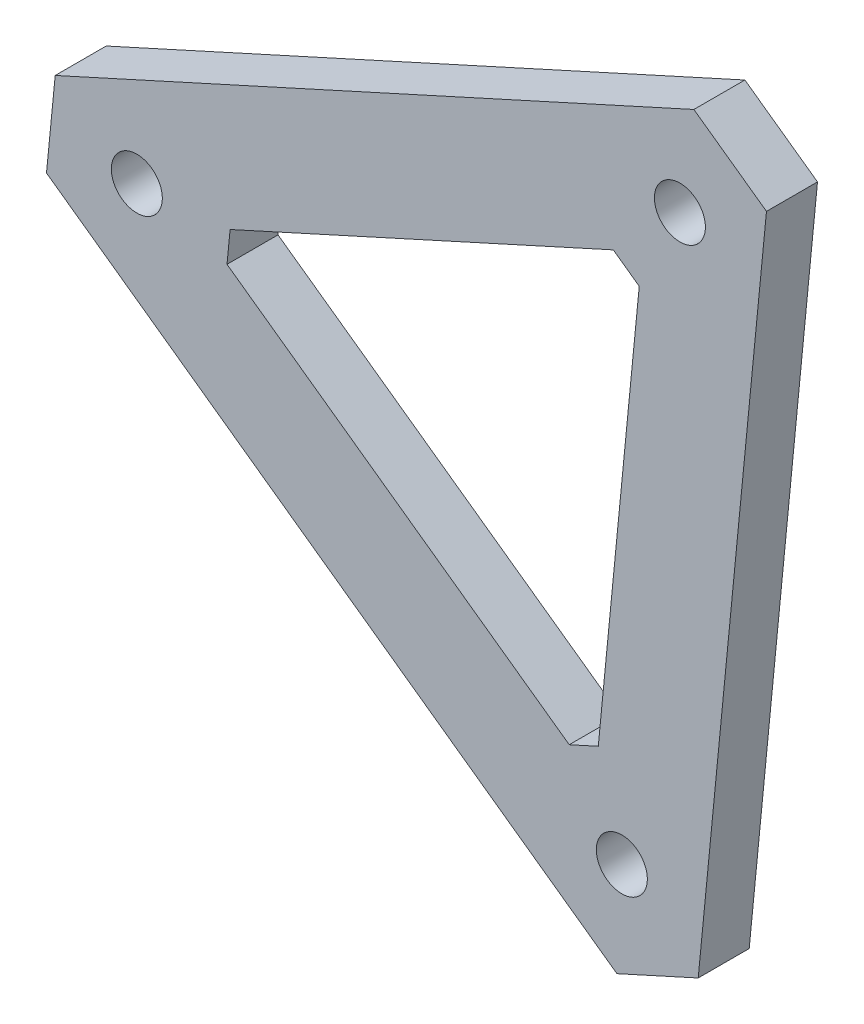
ISO-10303-21;
HEADER;
FILE_DESCRIPTION(('STEP AP214'),'2;1');
FILE_NAME('part.step','',(''),(''),'','','');
FILE_SCHEMA(('AUTOMOTIVE_DESIGN { 1 0 10303 214 1 1 1 1 }'));
ENDSEC;
DATA;
#1=APPLICATION_CONTEXT('core data for automotive mechanical design processes');
#2=APPLICATION_PROTOCOL_DEFINITION('international standard','automotive_design',2000,#1);
#3=PRODUCT_CONTEXT('',#1,'mechanical');
#4=PRODUCT('Part','Part','',(#3));
#5=PRODUCT_RELATED_PRODUCT_CATEGORY('part','',(#4));
#6=PRODUCT_DEFINITION_FORMATION('','',#4);
#7=PRODUCT_DEFINITION_CONTEXT('part definition',#1,'design');
#8=PRODUCT_DEFINITION('design','',#6,#7);
#9=PRODUCT_DEFINITION_SHAPE('','',#8);
#10=(LENGTH_UNIT() NAMED_UNIT(*) SI_UNIT(.MILLI.,.METRE.));
#11=(NAMED_UNIT(*) PLANE_ANGLE_UNIT() SI_UNIT($,.RADIAN.));
#12=(NAMED_UNIT(*) SI_UNIT($,.STERADIAN.) SOLID_ANGLE_UNIT());
#13=UNCERTAINTY_MEASURE_WITH_UNIT(LENGTH_MEASURE(1.E-05),#10,'distance_accuracy_value','');
#14=(GEOMETRIC_REPRESENTATION_CONTEXT(3) GLOBAL_UNCERTAINTY_ASSIGNED_CONTEXT((#13)) GLOBAL_UNIT_ASSIGNED_CONTEXT((#10,
#11,#12)) REPRESENTATION_CONTEXT('',''));
#15=CARTESIAN_POINT('',(0.,0.,0.));
#16=DIRECTION('',(0.,0.,1.));
#17=DIRECTION('',(1.,0.,0.));
#18=AXIS2_PLACEMENT_3D('',#15,#16,#17);
#19=CARTESIAN_POINT('',(277.371059914553,170.655756993951,-25.4));
#20=DIRECTION('',(0.581941296119595,0.813230796189277,0.));
#21=DIRECTION('',(-0.813230796189277,0.581941296119595,0.));
#22=AXIS2_PLACEMENT_3D('',#19,#20,#21);
#23=PLANE('',#22);
#24=DIRECTION('',(-0.813230796189277,0.581941296119595,0.));
#25=VECTOR('',#24,1.);
#26=CARTESIAN_POINT('',(277.371059914553,170.655756993951,0.));
#27=LINE('',#26,#25);
#28=CARTESIAN_POINT('',(313.519168805166,144.788466381435,0.));
#29=VERTEX_POINT('',#28);
#30=CARTESIAN_POINT('',(277.371059914553,170.655756993951,0.));
#31=VERTEX_POINT('',#30);
#32=EDGE_CURVE('E192',#29,#31,#27,.T.);
#33=ORIENTED_EDGE('',*,*,#32,.F.);
#34=DIRECTION('',(0.,0.,1.));
#35=VECTOR('',#34,1.);
#36=CARTESIAN_POINT('',(313.519168805166,144.788466381435,-25.4));
#37=LINE('',#36,#35);
#38=CARTESIAN_POINT('',(313.519168805166,144.788466381435,-25.4));
#39=VERTEX_POINT('',#38);
#40=EDGE_CURVE('E11',#39,#29,#37,.T.);
#41=ORIENTED_EDGE('',*,*,#40,.F.);
#42=DIRECTION('',(-0.813230796189277,0.581941296119595,0.));
#43=VECTOR('',#42,1.);
#44=CARTESIAN_POINT('',(277.371059914553,170.655756993951,-25.4));
#45=LINE('',#44,#43);
#46=CARTESIAN_POINT('',(277.371059914553,170.655756993951,-25.4));
#47=VERTEX_POINT('',#46);
#48=EDGE_CURVE('E195',#39,#47,#45,.T.);
#49=ORIENTED_EDGE('',*,*,#48,.T.);
#50=DIRECTION('',(0.,0.,1.));
#51=VECTOR('',#50,1.);
#52=CARTESIAN_POINT('',(277.371059914553,170.655756993951,-25.4));
#53=LINE('',#52,#51);
#54=EDGE_CURVE('E40',#47,#31,#53,.T.);
#55=ORIENTED_EDGE('',*,*,#54,.T.);
#56=EDGE_LOOP('',(#33,#41,#49,#55));
#57=FACE_BOUND('',#56,.T.);
#58=ADVANCED_FACE('F37',(#57),#23,.T.);
#59=CARTESIAN_POINT('',(279.515997466396,-202.802308580885,-25.4));
#60=DIRECTION('',(0.995249176699556,-0.0973605478561793,0.));
#61=DIRECTION('',(0.0973605478561793,0.995249176699556,0.));
#62=AXIS2_PLACEMENT_3D('',#59,#60,#61);
#63=PLANE('',#62);
#64=DIRECTION('',(0.0973605478561793,0.995249176699556,0.));
#65=VECTOR('',#64,1.);
#66=CARTESIAN_POINT('',(279.515997466396,-202.802308580885,0.));
#67=LINE('',#66,#65);
#68=CARTESIAN_POINT('',(279.515997466396,-202.802308580885,0.));
#69=VERTEX_POINT('',#68);
#70=EDGE_CURVE('E199',#69,#29,#67,.T.);
#71=ORIENTED_EDGE('',*,*,#70,.F.);
#72=DIRECTION('',(0.,0.,1.));
#73=VECTOR('',#72,1.);
#74=CARTESIAN_POINT('',(279.515997466396,-202.802308580885,-25.4));
#75=LINE('',#74,#73);
#76=CARTESIAN_POINT('',(279.515997466396,-202.802308580885,-25.4));
#77=VERTEX_POINT('',#76);
#78=EDGE_CURVE('E45',#77,#69,#75,.T.);
#79=ORIENTED_EDGE('',*,*,#78,.F.);
#80=DIRECTION('',(0.0973605478561793,0.995249176699556,0.));
#81=VECTOR('',#80,1.);
#82=CARTESIAN_POINT('',(279.515997466396,-202.802308580885,-25.4));
#83=LINE('',#82,#81);
#84=EDGE_CURVE('E211',#77,#39,#83,.T.);
#85=ORIENTED_EDGE('',*,*,#84,.T.);
#86=ORIENTED_EDGE('',*,*,#40,.T.);
#87=EDGE_LOOP('',(#71,#79,#85,#86));
#88=FACE_BOUND('',#87,.T.);
#89=ADVANCED_FACE('F248',(#88),#63,.T.);
#90=CARTESIAN_POINT('',(239.040212223575,-221.173843872663,-25.4));
#91=DIRECTION('',(0.413307880579936,-0.910591344045462,0.));
#92=DIRECTION('',(0.910591344045462,0.413307880579936,0.));
#93=AXIS2_PLACEMENT_3D('',#90,#91,#92);
#94=PLANE('',#93);
#95=DIRECTION('',(0.910591344045462,0.413307880579936,0.));
#96=VECTOR('',#95,1.);
#97=CARTESIAN_POINT('',(239.040212223575,-221.173843872663,0.));
#98=LINE('',#97,#96);
#99=CARTESIAN_POINT('',(239.040212223575,-221.173843872663,0.));
#100=VERTEX_POINT('',#99);
#101=EDGE_CURVE('E225',#100,#69,#98,.T.);
#102=ORIENTED_EDGE('',*,*,#101,.F.);
#103=DIRECTION('',(0.,0.,1.));
#104=VECTOR('',#103,1.);
#105=CARTESIAN_POINT('',(239.040212223575,-221.173843872663,-25.4));
#106=LINE('',#105,#104);
#107=CARTESIAN_POINT('',(239.040212223575,-221.173843872663,-25.4));
#108=VERTEX_POINT('',#107);
#109=EDGE_CURVE('E231',#108,#100,#106,.T.);
#110=ORIENTED_EDGE('',*,*,#109,.F.);
#111=DIRECTION('',(0.910591344045462,0.413307880579936,0.));
#112=VECTOR('',#111,1.);
#113=CARTESIAN_POINT('',(239.040212223575,-221.173843872663,-25.4));
#114=LINE('',#113,#112);
#115=EDGE_CURVE('E208',#108,#77,#114,.T.);
#116=ORIENTED_EDGE('',*,*,#115,.T.);
#117=ORIENTED_EDGE('',*,*,#78,.T.);
#118=EDGE_LOOP('',(#102,#110,#116,#117));
#119=FACE_BOUND('',#118,.T.);
#120=ADVANCED_FACE('F260',(#119),#94,.T.);
#121=CARTESIAN_POINT('',(-44.9806433455296,-17.9308462028934,-25.4));
#122=DIRECTION('',(-0.581941296119598,-0.813230796189275,0.));
#123=DIRECTION('',(0.813230796189276,-0.581941296119598,0.));
#124=AXIS2_PLACEMENT_3D('',#121,#122,#123);
#125=PLANE('',#124);
#126=DIRECTION('',(0.813230796189275,-0.581941296119598,0.));
#127=VECTOR('',#126,1.);
#128=CARTESIAN_POINT('',(-44.9806433455296,-17.9308462028934,0.));
#129=LINE('',#128,#127);
#130=CARTESIAN_POINT('',(-44.9806433455296,-17.9308462028934,0.));
#131=VERTEX_POINT('',#130);
#132=EDGE_CURVE('E222',#131,#100,#129,.T.);
#133=ORIENTED_EDGE('',*,*,#132,.F.);
#134=DIRECTION('',(0.,0.,1.));
#135=VECTOR('',#134,1.);
#136=CARTESIAN_POINT('',(-44.9806433455296,-17.9308462028934,-25.4));
#137=LINE('',#136,#135);
#138=CARTESIAN_POINT('',(-44.9806433455296,-17.9308462028934,-25.4));
#139=VERTEX_POINT('',#138);
#140=EDGE_CURVE('E233',#139,#131,#137,.T.);
#141=ORIENTED_EDGE('',*,*,#140,.F.);
#142=DIRECTION('',(0.813230796189275,-0.581941296119598,0.));
#143=VECTOR('',#142,1.);
#144=CARTESIAN_POINT('',(-44.9806433455296,-17.9308462028934,-25.4));
#145=LINE('',#144,#143);
#146=EDGE_CURVE('E205',#139,#108,#145,.T.);
#147=ORIENTED_EDGE('',*,*,#146,.T.);
#148=ORIENTED_EDGE('',*,*,#109,.T.);
#149=EDGE_LOOP('',(#133,#141,#147,#148));
#150=FACE_BOUND('',#149,.T.);
#151=ADVANCED_FACE('F258',(#150),#125,.T.);
#152=CARTESIAN_POINT('',(-40.6529669933218,26.3079797014018,-25.4));
#153=DIRECTION('',(-0.995249176699555,0.0973605478561946,0.));
#154=DIRECTION('',(-0.0973605478561946,-0.995249176699555,0.));
#155=AXIS2_PLACEMENT_3D('',#152,#153,#154);
#156=PLANE('',#155);
#157=DIRECTION('',(-0.0973605478561946,-0.995249176699555,0.));
#158=VECTOR('',#157,1.);
#159=CARTESIAN_POINT('',(-40.6529669933218,26.3079797014018,0.));
#160=LINE('',#159,#158);
#161=CARTESIAN_POINT('',(-40.6529669933218,26.3079797014018,0.));
#162=VERTEX_POINT('',#161);
#163=EDGE_CURVE('E219',#162,#131,#160,.T.);
#164=ORIENTED_EDGE('',*,*,#163,.F.);
#165=DIRECTION('',(0.,0.,1.));
#166=VECTOR('',#165,1.);
#167=CARTESIAN_POINT('',(-40.6529669933218,26.3079797014018,-25.4));
#168=LINE('',#167,#166);
#169=CARTESIAN_POINT('',(-40.6529669933218,26.3079797014018,-25.4));
#170=VERTEX_POINT('',#169);
#171=EDGE_CURVE('E234',#170,#162,#168,.T.);
#172=ORIENTED_EDGE('',*,*,#171,.F.);
#173=DIRECTION('',(-0.0973605478561946,-0.995249176699555,0.));
#174=VECTOR('',#173,1.);
#175=CARTESIAN_POINT('',(-40.6529669933218,26.3079797014018,-25.4));
#176=LINE('',#175,#174);
#177=EDGE_CURVE('E202',#170,#139,#176,.T.);
#178=ORIENTED_EDGE('',*,*,#177,.T.);
#179=ORIENTED_EDGE('',*,*,#140,.T.);
#180=EDGE_LOOP('',(#164,#172,#178,#179));
#181=FACE_BOUND('',#180,.T.);
#182=ADVANCED_FACE('F255',(#181),#156,.T.);
#183=CARTESIAN_POINT('',(277.371059914553,170.655756993951,-25.4));
#184=DIRECTION('',(-0.413307880579956,0.910591344045453,0.));
#185=DIRECTION('',(-0.910591344045453,-0.413307880579955,0.));
#186=AXIS2_PLACEMENT_3D('',#183,#184,#185);
#187=PLANE('',#186);
#188=DIRECTION('',(-0.910591344045453,-0.413307880579956,0.));
#189=VECTOR('',#188,1.);
#190=CARTESIAN_POINT('',(277.371059914553,170.655756993951,0.));
#191=LINE('',#190,#189);
#192=EDGE_CURVE('E216',#31,#162,#191,.T.);
#193=ORIENTED_EDGE('',*,*,#192,.F.);
#194=ORIENTED_EDGE('',*,*,#54,.F.);
#195=DIRECTION('',(-0.910591344045453,-0.413307880579956,0.));
#196=VECTOR('',#195,1.);
#197=CARTESIAN_POINT('',(277.371059914553,170.655756993951,-25.4));
#198=LINE('',#197,#196);
#199=EDGE_CURVE('E198',#47,#170,#198,.T.);
#200=ORIENTED_EDGE('',*,*,#199,.T.);
#201=ORIENTED_EDGE('',*,*,#171,.T.);
#202=EDGE_LOOP('',(#193,#194,#200,#201));
#203=FACE_BOUND('',#202,.T.);
#204=ADVANCED_FACE('F242',(#203),#187,.T.);
#205=CARTESIAN_POINT('',(-6.64979565454638,373.898754663716,-25.4));
#206=DIRECTION('',(0.,0.,-1.));
#207=DIRECTION('',(-1.,0.,0.));
#208=AXIS2_PLACEMENT_3D('',#205,#206,#207);
#209=PLANE('',#208);
#210=CARTESIAN_POINT('',(241.497107470573,-172.813351866535,-25.4));
#211=DIRECTION('',(0.,0.,1.));
#212=DIRECTION('',(1.,0.,0.));
#213=AXIS2_PLACEMENT_3D('',#210,#211,#212);
#214=CIRCLE('',#213,12.7);
#215=CARTESIAN_POINT('',(254.197107470573,-172.813351866535,-25.4));
#216=VERTEX_POINT('',#215);
#217=EDGE_CURVE('E163',#216,#216,#214,.T.);
#218=ORIENTED_EDGE('',*,*,#217,.T.);
#219=EDGE_LOOP('',(#218));
#220=FACE_BOUND('',#219,.T.);
#221=DIRECTION('',(-0.813230796189273,0.5819412961196,0.));
#222=VECTOR('',#221,1.);
#223=CARTESIAN_POINT('',(250.162803153211,80.8028926971345,-25.4));
#224=LINE('',#223,#222);
#225=CARTESIAN_POINT('',(250.162803153211,80.8028926971345,-25.4));
#226=VERTEX_POINT('',#225);
#227=CARTESIAN_POINT('',(237.252764263706,90.0412107730331,-25.4));
#228=VERTEX_POINT('',#227);
#229=EDGE_CURVE('E128',#226,#228,#224,.T.);
#230=ORIENTED_EDGE('',*,*,#229,.T.);
#231=DIRECTION('',(-0.910591344045453,-0.413307880579956,0.));
#232=VECTOR('',#231,1.);
#233=CARTESIAN_POINT('',(237.252764263706,90.0412107730331,-25.4));
#234=LINE('',#233,#232);
#235=CARTESIAN_POINT('',(46.4383481189815,3.43254439750325,-25.4));
#236=VERTEX_POINT('',#235);
#237=EDGE_CURVE('E137',#228,#236,#234,.T.);
#238=ORIENTED_EDGE('',*,*,#237,.T.);
#239=DIRECTION('',(-0.0973605478561787,-0.995249176699556,0.));
#240=VECTOR('',#239,1.);
#241=CARTESIAN_POINT('',(46.4383481189815,3.43254439750328,-25.4));
#242=LINE('',#241,#240);
#243=CARTESIAN_POINT('',(44.8927494217646,-12.3670362826022,-25.4));
#244=VERTEX_POINT('',#243);
#245=EDGE_CURVE('E53',#236,#244,#242,.T.);
#246=ORIENTED_EDGE('',*,*,#245,.T.);
#247=DIRECTION('',(0.813230796189274,-0.5819412961196,0.));
#248=VECTOR('',#247,1.);
#249=CARTESIAN_POINT('',(44.8927494217646,-12.3670362826022,-25.4));
#250=LINE('',#249,#248);
#251=CARTESIAN_POINT('',(215.305262763227,-134.312834884464,-25.4));
#252=VERTEX_POINT('',#251);
#253=EDGE_CURVE('E155',#244,#252,#250,.T.);
#254=ORIENTED_EDGE('',*,*,#253,.T.);
#255=DIRECTION('',(0.910591344045454,0.413307880579955,0.));
#256=VECTOR('',#255,1.);
#257=CARTESIAN_POINT('',(215.305262763227,-134.312834884464,-25.4));
#258=LINE('',#257,#256);
#259=CARTESIAN_POINT('',(229.760900349949,-127.751572280258,-25.4));
#260=VERTEX_POINT('',#259);
#261=EDGE_CURVE('E158',#252,#260,#258,.T.);
#262=ORIENTED_EDGE('',*,*,#261,.T.);
#263=DIRECTION('',(0.0973605478561792,0.995249176699556,0.));
#264=VECTOR('',#263,1.);
#265=CARTESIAN_POINT('',(229.760900349949,-127.751572280258,-25.4));
#266=LINE('',#265,#264);
#267=EDGE_CURVE('E134',#260,#226,#266,.T.);
#268=ORIENTED_EDGE('',*,*,#267,.T.);
#269=EDGE_LOOP('',(#230,#238,#246,#254,#262,#268));
#270=FACE_BOUND('',#269,.T.);
#271=CARTESIAN_POINT('',(270.409306564845,122.735954076708,-25.4));
#272=DIRECTION('',(0.,0.,1.));
#273=DIRECTION('',(1.,0.,0.));
#274=AXIS2_PLACEMENT_3D('',#271,#272,#273);
#275=CIRCLE('',#274,12.7);
#276=CARTESIAN_POINT('',(283.109306564845,122.735954076708,-25.4));
#277=VERTEX_POINT('',#276);
#278=EDGE_CURVE('E183',#277,#277,#275,.T.);
#279=ORIENTED_EDGE('',*,*,#278,.T.);
#280=EDGE_LOOP('',(#279));
#281=FACE_BOUND('',#280,.T.);
#282=CARTESIAN_POINT('',(1.66533453693773E-13,-2.04697370165263E-13,-25.4));
#283=DIRECTION('',(0.,0.,1.));
#284=DIRECTION('',(1.,0.,0.));
#285=AXIS2_PLACEMENT_3D('',#282,#283,#284);
#286=CIRCLE('',#285,12.7);
#287=CARTESIAN_POINT('',(12.7000000000002,-2.04697370165263E-13,-25.4));
#288=VERTEX_POINT('',#287);
#289=EDGE_CURVE('E189',#288,#288,#286,.T.);
#290=ORIENTED_EDGE('',*,*,#289,.T.);
#291=EDGE_LOOP('',(#290));
#292=FACE_BOUND('',#291,.T.);
#293=ORIENTED_EDGE('',*,*,#48,.F.);
#294=ORIENTED_EDGE('',*,*,#84,.F.);
#295=ORIENTED_EDGE('',*,*,#115,.F.);
#296=ORIENTED_EDGE('',*,*,#146,.F.);
#297=ORIENTED_EDGE('',*,*,#177,.F.);
#298=ORIENTED_EDGE('',*,*,#199,.F.);
#299=EDGE_LOOP('',(#293,#294,#295,#296,#297,#298));
#300=FACE_BOUND('',#299,.T.);
#301=ADVANCED_FACE('F141',(#220,#270,#281,#292,#300),#209,.T.);
#302=CARTESIAN_POINT('',(-6.64979565454638,373.898754663716,0.));
#303=DIRECTION('',(0.,0.,-1.));
#304=DIRECTION('',(-1.,0.,0.));
#305=AXIS2_PLACEMENT_3D('',#302,#303,#304);
#306=PLANE('',#305);
#307=CARTESIAN_POINT('',(241.497107470573,-172.813351866535,0.));
#308=DIRECTION('',(0.,0.,1.));
#309=DIRECTION('',(1.,0.,0.));
#310=AXIS2_PLACEMENT_3D('',#307,#308,#309);
#311=CIRCLE('',#310,12.7);
#312=CARTESIAN_POINT('',(254.197107470573,-172.813351866535,0.));
#313=VERTEX_POINT('',#312);
#314=EDGE_CURVE('E151',#313,#313,#311,.T.);
#315=ORIENTED_EDGE('',*,*,#314,.F.);
#316=EDGE_LOOP('',(#315));
#317=FACE_BOUND('',#316,.T.);
#318=DIRECTION('',(-0.910591344045453,-0.413307880579956,0.));
#319=VECTOR('',#318,1.);
#320=CARTESIAN_POINT('',(237.252764263706,90.0412107730331,0.));
#321=LINE('',#320,#319);
#322=CARTESIAN_POINT('',(237.252764263706,90.0412107730331,0.));
#323=VERTEX_POINT('',#322);
#324=CARTESIAN_POINT('',(46.4383481189815,3.43254439750328,0.));
#325=VERTEX_POINT('',#324);
#326=EDGE_CURVE('E162',#323,#325,#321,.T.);
#327=ORIENTED_EDGE('',*,*,#326,.F.);
#328=DIRECTION('',(-0.813230796189273,0.5819412961196,0.));
#329=VECTOR('',#328,1.);
#330=CARTESIAN_POINT('',(250.162803153211,80.8028926971345,0.));
#331=LINE('',#330,#329);
#332=CARTESIAN_POINT('',(250.162803153211,80.8028926971345,0.));
#333=VERTEX_POINT('',#332);
#334=EDGE_CURVE('E61',#333,#323,#331,.T.);
#335=ORIENTED_EDGE('',*,*,#334,.F.);
#336=DIRECTION('',(0.0973605478561792,0.995249176699556,0.));
#337=VECTOR('',#336,1.);
#338=CARTESIAN_POINT('',(229.760900349949,-127.751572280258,0.));
#339=LINE('',#338,#337);
#340=CARTESIAN_POINT('',(229.760900349949,-127.751572280258,0.));
#341=VERTEX_POINT('',#340);
#342=EDGE_CURVE('E145',#341,#333,#339,.T.);
#343=ORIENTED_EDGE('',*,*,#342,.F.);
#344=DIRECTION('',(0.910591344045454,0.413307880579955,0.));
#345=VECTOR('',#344,1.);
#346=CARTESIAN_POINT('',(215.305262763227,-134.312834884464,0.));
#347=LINE('',#346,#345);
#348=CARTESIAN_POINT('',(215.305262763227,-134.312834884464,0.));
#349=VERTEX_POINT('',#348);
#350=EDGE_CURVE('E148',#349,#341,#347,.T.);
#351=ORIENTED_EDGE('',*,*,#350,.F.);
#352=DIRECTION('',(0.813230796189274,-0.5819412961196,0.));
#353=VECTOR('',#352,1.);
#354=CARTESIAN_POINT('',(44.8927494217646,-12.3670362826022,0.));
#355=LINE('',#354,#353);
#356=CARTESIAN_POINT('',(44.8927494217646,-12.3670362826022,0.));
#357=VERTEX_POINT('',#356);
#358=EDGE_CURVE('E168',#357,#349,#355,.T.);
#359=ORIENTED_EDGE('',*,*,#358,.F.);
#360=DIRECTION('',(-0.0973605478561787,-0.995249176699556,0.));
#361=VECTOR('',#360,1.);
#362=CARTESIAN_POINT('',(46.4383481189815,3.43254439750328,0.));
#363=LINE('',#362,#361);
#364=EDGE_CURVE('E165',#325,#357,#363,.T.);
#365=ORIENTED_EDGE('',*,*,#364,.F.);
#366=EDGE_LOOP('',(#327,#335,#343,#351,#359,#365));
#367=FACE_BOUND('',#366,.T.);
#368=CARTESIAN_POINT('',(270.409306564845,122.735954076708,0.));
#369=DIRECTION('',(0.,0.,1.));
#370=DIRECTION('',(1.,0.,0.));
#371=AXIS2_PLACEMENT_3D('',#368,#369,#370);
#372=CIRCLE('',#371,12.7);
#373=CARTESIAN_POINT('',(283.109306564845,122.735954076708,0.));
#374=VERTEX_POINT('',#373);
#375=EDGE_CURVE('E175',#374,#374,#372,.T.);
#376=ORIENTED_EDGE('',*,*,#375,.F.);
#377=EDGE_LOOP('',(#376));
#378=FACE_BOUND('',#377,.T.);
#379=CARTESIAN_POINT('',(1.66533453693773E-13,-2.04697370165263E-13,0.));
#380=DIRECTION('',(0.,0.,1.));
#381=DIRECTION('',(1.,0.,0.));
#382=AXIS2_PLACEMENT_3D('',#379,#380,#381);
#383=CIRCLE('',#382,12.7);
#384=CARTESIAN_POINT('',(12.7000000000002,-2.04697370165263E-13,0.));
#385=VERTEX_POINT('',#384);
#386=EDGE_CURVE('E186',#385,#385,#383,.T.);
#387=ORIENTED_EDGE('',*,*,#386,.F.);
#388=EDGE_LOOP('',(#387));
#389=FACE_BOUND('',#388,.T.);
#390=ORIENTED_EDGE('',*,*,#32,.T.);
#391=ORIENTED_EDGE('',*,*,#192,.T.);
#392=ORIENTED_EDGE('',*,*,#163,.T.);
#393=ORIENTED_EDGE('',*,*,#132,.T.);
#394=ORIENTED_EDGE('',*,*,#101,.T.);
#395=ORIENTED_EDGE('',*,*,#70,.T.);
#396=EDGE_LOOP('',(#390,#391,#392,#393,#394,#395));
#397=FACE_BOUND('',#396,.T.);
#398=ADVANCED_FACE('F244',(#317,#367,#378,#389,#397),#306,.F.);
#399=CARTESIAN_POINT('',(1.66533453693773E-13,-2.04697370165263E-13,-25.4));
#400=DIRECTION('',(0.,0.,1.));
#401=DIRECTION('',(1.,0.,0.));
#402=AXIS2_PLACEMENT_3D('',#399,#400,#401);
#403=CYLINDRICAL_SURFACE('',#402,12.7);
#404=ORIENTED_EDGE('',*,*,#289,.F.);
#405=EDGE_LOOP('',(#404));
#406=FACE_BOUND('',#405,.T.);
#407=ORIENTED_EDGE('',*,*,#386,.T.);
#408=EDGE_LOOP('',(#407));
#409=FACE_BOUND('',#408,.T.);
#410=ADVANCED_FACE('F307',(#406,#409),#403,.F.);
#411=CARTESIAN_POINT('',(270.409306564845,122.735954076708,-25.4));
#412=DIRECTION('',(0.,0.,1.));
#413=DIRECTION('',(1.,0.,0.));
#414=AXIS2_PLACEMENT_3D('',#411,#412,#413);
#415=CYLINDRICAL_SURFACE('',#414,12.7);
#416=ORIENTED_EDGE('',*,*,#278,.F.);
#417=EDGE_LOOP('',(#416));
#418=FACE_BOUND('',#417,.T.);
#419=ORIENTED_EDGE('',*,*,#375,.T.);
#420=EDGE_LOOP('',(#419));
#421=FACE_BOUND('',#420,.T.);
#422=ADVANCED_FACE('F315',(#418,#421),#415,.F.);
#423=CARTESIAN_POINT('',(250.162803153211,80.8028926971345,-25.4));
#424=DIRECTION('',(0.5819412961196,0.813230796189273,0.));
#425=DIRECTION('',(-0.813230796189274,0.5819412961196,0.));
#426=AXIS2_PLACEMENT_3D('',#423,#424,#425);
#427=PLANE('',#426);
#428=ORIENTED_EDGE('',*,*,#334,.T.);
#429=DIRECTION('',(0.,0.,1.));
#430=VECTOR('',#429,1.);
#431=CARTESIAN_POINT('',(237.252764263706,90.0412107730331,-25.4));
#432=LINE('',#431,#430);
#433=EDGE_CURVE('E124',#228,#323,#432,.T.);
#434=ORIENTED_EDGE('',*,*,#433,.F.);
#435=ORIENTED_EDGE('',*,*,#229,.F.);
#436=DIRECTION('',(0.,0.,1.));
#437=VECTOR('',#436,1.);
#438=CARTESIAN_POINT('',(250.162803153211,80.8028926971345,-25.4));
#439=LINE('',#438,#437);
#440=EDGE_CURVE('E173',#226,#333,#439,.T.);
#441=ORIENTED_EDGE('',*,*,#440,.T.);
#442=EDGE_LOOP('',(#428,#434,#435,#441));
#443=FACE_BOUND('',#442,.T.);
#444=ADVANCED_FACE('F126',(#443),#427,.F.);
#445=CARTESIAN_POINT('',(229.760900349949,-127.751572280258,-25.4));
#446=DIRECTION('',(0.995249176699556,-0.0973605478561792,0.));
#447=DIRECTION('',(0.0973605478561792,0.995249176699556,0.));
#448=AXIS2_PLACEMENT_3D('',#445,#446,#447);
#449=PLANE('',#448);
#450=ORIENTED_EDGE('',*,*,#342,.T.);
#451=ORIENTED_EDGE('',*,*,#440,.F.);
#452=ORIENTED_EDGE('',*,*,#267,.F.);
#453=DIRECTION('',(0.,0.,1.));
#454=VECTOR('',#453,1.);
#455=CARTESIAN_POINT('',(229.760900349949,-127.751572280258,-25.4));
#456=LINE('',#455,#454);
#457=EDGE_CURVE('E176',#260,#341,#456,.T.);
#458=ORIENTED_EDGE('',*,*,#457,.T.);
#459=EDGE_LOOP('',(#450,#451,#452,#458));
#460=FACE_BOUND('',#459,.T.);
#461=ADVANCED_FACE('F330',(#460),#449,.F.);
#462=CARTESIAN_POINT('',(215.305262763227,-134.312834884464,-25.4));
#463=DIRECTION('',(0.413307880579955,-0.910591344045454,0.));
#464=DIRECTION('',(0.910591344045454,0.413307880579955,0.));
#465=AXIS2_PLACEMENT_3D('',#462,#463,#464);
#466=PLANE('',#465);
#467=ORIENTED_EDGE('',*,*,#350,.T.);
#468=ORIENTED_EDGE('',*,*,#457,.F.);
#469=ORIENTED_EDGE('',*,*,#261,.F.);
#470=DIRECTION('',(0.,0.,1.));
#471=VECTOR('',#470,1.);
#472=CARTESIAN_POINT('',(215.305262763227,-134.312834884464,-25.4));
#473=LINE('',#472,#471);
#474=EDGE_CURVE('E178',#252,#349,#473,.T.);
#475=ORIENTED_EDGE('',*,*,#474,.T.);
#476=EDGE_LOOP('',(#467,#468,#469,#475));
#477=FACE_BOUND('',#476,.T.);
#478=ADVANCED_FACE('F337',(#477),#466,.F.);
#479=CARTESIAN_POINT('',(44.8927494217646,-12.3670362826022,-25.4));
#480=DIRECTION('',(-0.5819412961196,-0.813230796189274,0.));
#481=DIRECTION('',(0.813230796189274,-0.5819412961196,0.));
#482=AXIS2_PLACEMENT_3D('',#479,#480,#481);
#483=PLANE('',#482);
#484=ORIENTED_EDGE('',*,*,#358,.T.);
#485=ORIENTED_EDGE('',*,*,#474,.F.);
#486=ORIENTED_EDGE('',*,*,#253,.F.);
#487=DIRECTION('',(0.,0.,1.));
#488=VECTOR('',#487,1.);
#489=CARTESIAN_POINT('',(44.8927494217646,-12.3670362826022,-25.4));
#490=LINE('',#489,#488);
#491=EDGE_CURVE('E180',#244,#357,#490,.T.);
#492=ORIENTED_EDGE('',*,*,#491,.T.);
#493=EDGE_LOOP('',(#484,#485,#486,#492));
#494=FACE_BOUND('',#493,.T.);
#495=ADVANCED_FACE('F345',(#494),#483,.F.);
#496=CARTESIAN_POINT('',(46.4383481189815,3.43254439750328,-25.4));
#497=DIRECTION('',(-0.995249176699556,0.0973605478561787,0.));
#498=DIRECTION('',(-0.0973605478561787,-0.995249176699556,0.));
#499=AXIS2_PLACEMENT_3D('',#496,#497,#498);
#500=PLANE('',#499);
#501=ORIENTED_EDGE('',*,*,#364,.T.);
#502=ORIENTED_EDGE('',*,*,#491,.F.);
#503=ORIENTED_EDGE('',*,*,#245,.F.);
#504=DIRECTION('',(0.,0.,1.));
#505=VECTOR('',#504,1.);
#506=CARTESIAN_POINT('',(46.4383481189815,3.43254439750328,-25.4));
#507=LINE('',#506,#505);
#508=EDGE_CURVE('E133',#236,#325,#507,.T.);
#509=ORIENTED_EDGE('',*,*,#508,.T.);
#510=EDGE_LOOP('',(#501,#502,#503,#509));
#511=FACE_BOUND('',#510,.T.);
#512=ADVANCED_FACE('F353',(#511),#500,.F.);
#513=CARTESIAN_POINT('',(237.252764263706,90.0412107730331,-25.4));
#514=DIRECTION('',(-0.413307880579956,0.910591344045453,0.));
#515=DIRECTION('',(-0.910591344045453,-0.413307880579956,0.));
#516=AXIS2_PLACEMENT_3D('',#513,#514,#515);
#517=PLANE('',#516);
#518=ORIENTED_EDGE('',*,*,#326,.T.);
#519=ORIENTED_EDGE('',*,*,#508,.F.);
#520=ORIENTED_EDGE('',*,*,#237,.F.);
#521=ORIENTED_EDGE('',*,*,#433,.T.);
#522=EDGE_LOOP('',(#518,#519,#520,#521));
#523=FACE_BOUND('',#522,.T.);
#524=ADVANCED_FACE('F138',(#523),#517,.F.);
#525=CARTESIAN_POINT('',(241.497107470573,-172.813351866535,-25.4));
#526=DIRECTION('',(0.,0.,1.));
#527=DIRECTION('',(1.,0.,0.));
#528=AXIS2_PLACEMENT_3D('',#525,#526,#527);
#529=CYLINDRICAL_SURFACE('',#528,12.7);
#530=ORIENTED_EDGE('',*,*,#217,.F.);
#531=EDGE_LOOP('',(#530));
#532=FACE_BOUND('',#531,.T.);
#533=ORIENTED_EDGE('',*,*,#314,.T.);
#534=EDGE_LOOP('',(#533));
#535=FACE_BOUND('',#534,.T.);
#536=ADVANCED_FACE('F367',(#532,#535),#529,.F.);
#537=CLOSED_SHELL('',(#58,#89,#120,#151,#182,#204,#301,#398,#410,#422,#444,#461,#478,#495,#512,
#524,#536));
#538=MANIFOLD_SOLID_BREP('B2',#537);
#539=ADVANCED_BREP_SHAPE_REPRESENTATION('',(#18,#538),#14);
#540=SHAPE_DEFINITION_REPRESENTATION(#9,#539);
ENDSEC;
END-ISO-10303-21;
